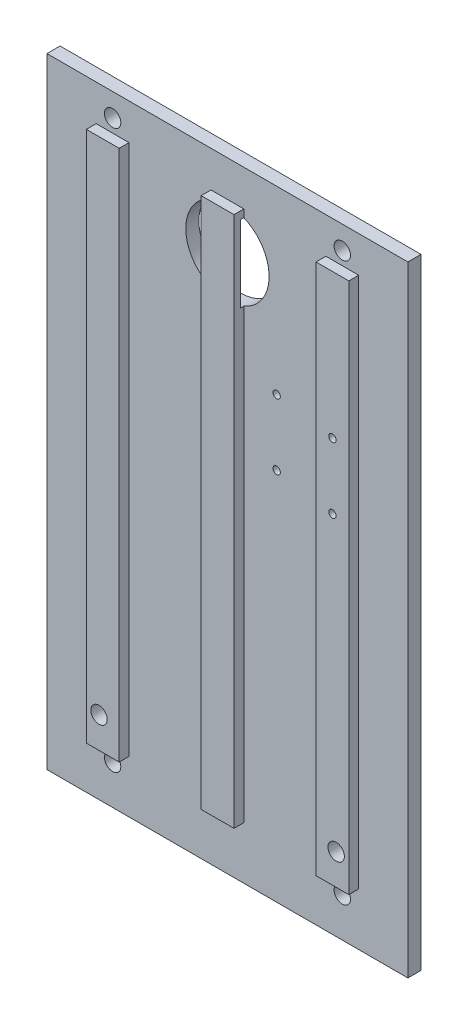
ISO-10303-21;
HEADER;
FILE_DESCRIPTION(('STEP AP214'),'2;1');
FILE_NAME('part.step','',(''),(''),'','','');
FILE_SCHEMA(('AUTOMOTIVE_DESIGN { 1 0 10303 214 1 1 1 1 }'));
ENDSEC;
DATA;
#1=APPLICATION_CONTEXT('core data for automotive mechanical design processes');
#2=APPLICATION_PROTOCOL_DEFINITION('international standard','automotive_design',2000,#1);
#3=PRODUCT_CONTEXT('',#1,'mechanical');
#4=PRODUCT('Part','Part','',(#3));
#5=PRODUCT_RELATED_PRODUCT_CATEGORY('part','',(#4));
#6=PRODUCT_DEFINITION_FORMATION('','',#4);
#7=PRODUCT_DEFINITION_CONTEXT('part definition',#1,'design');
#8=PRODUCT_DEFINITION('design','',#6,#7);
#9=PRODUCT_DEFINITION_SHAPE('','',#8);
#10=(LENGTH_UNIT() NAMED_UNIT(*) SI_UNIT(.MILLI.,.METRE.));
#11=(NAMED_UNIT(*) PLANE_ANGLE_UNIT() SI_UNIT($,.RADIAN.));
#12=(NAMED_UNIT(*) SI_UNIT($,.STERADIAN.) SOLID_ANGLE_UNIT());
#13=UNCERTAINTY_MEASURE_WITH_UNIT(LENGTH_MEASURE(1.E-05),#10,'distance_accuracy_value','');
#14=(GEOMETRIC_REPRESENTATION_CONTEXT(3) GLOBAL_UNCERTAINTY_ASSIGNED_CONTEXT((#13)) GLOBAL_UNIT_ASSIGNED_CONTEXT((#10,
#11,#12)) REPRESENTATION_CONTEXT('',''));
#15=CARTESIAN_POINT('',(0.,0.,0.));
#16=DIRECTION('',(0.,0.,1.));
#17=DIRECTION('',(1.,0.,0.));
#18=AXIS2_PLACEMENT_3D('',#15,#16,#17);
#19=CARTESIAN_POINT('',(0.,0.,4.));
#20=DIRECTION('',(0.,0.,-1.));
#21=DIRECTION('',(-1.,0.,0.));
#22=AXIS2_PLACEMENT_3D('',#19,#20,#21);
#23=PLANE('',#22);
#24=CARTESIAN_POINT('',(90.,182.,4.));
#25=DIRECTION('',(0.,0.,-1.));
#26=DIRECTION('',(-1.,0.,0.));
#27=AXIS2_PLACEMENT_3D('',#24,#25,#26);
#28=CIRCLE('',#27,2.5);
#29=CARTESIAN_POINT('',(87.5,182.,4.));
#30=VERTEX_POINT('',#29);
#31=EDGE_CURVE('E248',#30,#30,#28,.F.);
#32=ORIENTED_EDGE('',*,*,#31,.F.);
#33=EDGE_LOOP('',(#32));
#34=FACE_BOUND('',#33,.T.);
#35=CARTESIAN_POINT('',(70.,114.,4.));
#36=DIRECTION('',(0.,0.,-1.));
#37=DIRECTION('',(-1.,0.,0.));
#38=AXIS2_PLACEMENT_3D('',#35,#36,#37);
#39=CIRCLE('',#38,1.11999999999998);
#40=CARTESIAN_POINT('',(68.88,114.,4.));
#41=VERTEX_POINT('',#40);
#42=EDGE_CURVE('E228',#41,#41,#39,.T.);
#43=ORIENTED_EDGE('',*,*,#42,.T.);
#44=EDGE_LOOP('',(#43));
#45=FACE_BOUND('',#44,.T.);
#46=CARTESIAN_POINT('',(90.,12.,4.));
#47=DIRECTION('',(0.,0.,-1.));
#48=DIRECTION('',(-1.,0.,0.));
#49=AXIS2_PLACEMENT_3D('',#46,#47,#48);
#50=CIRCLE('',#49,2.5);
#51=CARTESIAN_POINT('',(87.5,12.,4.));
#52=VERTEX_POINT('',#51);
#53=EDGE_CURVE('E223',#52,#52,#50,.F.);
#54=ORIENTED_EDGE('',*,*,#53,.F.);
#55=EDGE_LOOP('',(#54));
#56=FACE_BOUND('',#55,.T.);
#57=DIRECTION('',(0.,-1.,0.));
#58=VECTOR('',#57,1.);
#59=CARTESIAN_POINT('',(15.,178.,4.));
#60=LINE('',#59,#58);
#61=CARTESIAN_POINT('',(15.,178.,4.));
#62=VERTEX_POINT('',#61);
#63=CARTESIAN_POINT('',(15.,16.,4.));
#64=VERTEX_POINT('',#63);
#65=EDGE_CURVE('E297',#62,#64,#60,.T.);
#66=ORIENTED_EDGE('',*,*,#65,.F.);
#67=DIRECTION('',(-1.,0.,0.));
#68=VECTOR('',#67,1.);
#69=CARTESIAN_POINT('',(15.,178.,4.));
#70=LINE('',#69,#68);
#71=CARTESIAN_POINT('',(25.,178.,4.));
#72=VERTEX_POINT('',#71);
#73=EDGE_CURVE('E303',#72,#62,#70,.T.);
#74=ORIENTED_EDGE('',*,*,#73,.F.);
#75=DIRECTION('',(0.,1.,0.));
#76=VECTOR('',#75,1.);
#77=CARTESIAN_POINT('',(25.,178.,4.));
#78=LINE('',#77,#76);
#79=CARTESIAN_POINT('',(25.,16.,4.));
#80=VERTEX_POINT('',#79);
#81=EDGE_CURVE('E320',#80,#72,#78,.T.);
#82=ORIENTED_EDGE('',*,*,#81,.F.);
#83=DIRECTION('',(1.,0.,0.));
#84=VECTOR('',#83,1.);
#85=CARTESIAN_POINT('',(15.,16.,4.));
#86=LINE('',#85,#84);
#87=EDGE_CURVE('E316',#64,#80,#86,.T.);
#88=ORIENTED_EDGE('',*,*,#87,.F.);
#89=EDGE_LOOP('',(#66,#74,#82,#88));
#90=FACE_BOUND('',#89,.T.);
#91=DIRECTION('',(0.,-1.,0.));
#92=VECTOR('',#91,1.);
#93=CARTESIAN_POINT('',(0.,0.,4.));
#94=LINE('',#93,#92);
#95=CARTESIAN_POINT('',(0.,189.,4.));
#96=VERTEX_POINT('',#95);
#97=CARTESIAN_POINT('',(0.,0.,4.));
#98=VERTEX_POINT('',#97);
#99=EDGE_CURVE('E387',#96,#98,#94,.T.);
#100=ORIENTED_EDGE('',*,*,#99,.T.);
#101=DIRECTION('',(1.,0.,0.));
#102=VECTOR('',#101,1.);
#103=CARTESIAN_POINT('',(0.,0.,4.));
#104=LINE('',#103,#102);
#105=CARTESIAN_POINT('',(110.,0.,4.));
#106=VERTEX_POINT('',#105);
#107=EDGE_CURVE('E391',#98,#106,#104,.T.);
#108=ORIENTED_EDGE('',*,*,#107,.T.);
#109=DIRECTION('',(0.,1.,0.));
#110=VECTOR('',#109,1.);
#111=CARTESIAN_POINT('',(110.,0.,4.));
#112=LINE('',#111,#110);
#113=CARTESIAN_POINT('',(110.,189.,4.));
#114=VERTEX_POINT('',#113);
#115=EDGE_CURVE('E395',#106,#114,#112,.T.);
#116=ORIENTED_EDGE('',*,*,#115,.T.);
#117=DIRECTION('',(-1.,0.,0.));
#118=VECTOR('',#117,1.);
#119=CARTESIAN_POINT('',(0.,189.,4.));
#120=LINE('',#119,#118);
#121=EDGE_CURVE('E398',#114,#96,#120,.T.);
#122=ORIENTED_EDGE('',*,*,#121,.T.);
#123=EDGE_LOOP('',(#100,#108,#116,#122));
#124=FACE_BOUND('',#123,.T.);
#125=DIRECTION('',(0.,1.,0.));
#126=VECTOR('',#125,1.);
#127=CARTESIAN_POINT('',(60.,178.,4.));
#128=LINE('',#127,#126);
#129=CARTESIAN_POINT('',(60.,175.67433081594,4.));
#130=VERTEX_POINT('',#129);
#131=CARTESIAN_POINT('',(60.,178.,4.));
#132=VERTEX_POINT('',#131);
#133=EDGE_CURVE('E364',#130,#132,#128,.T.);
#134=ORIENTED_EDGE('',*,*,#133,.F.);
#135=CARTESIAN_POINT('',(55.,164.,4.));
#136=DIRECTION('',(0.,0.,-1.));
#137=DIRECTION('',(-1.,0.,0.));
#138=AXIS2_PLACEMENT_3D('',#135,#136,#137);
#139=CIRCLE('',#138,12.7);
#140=CARTESIAN_POINT('',(60.,152.32566918406,4.));
#141=VERTEX_POINT('',#140);
#142=EDGE_CURVE('E177',#130,#141,#139,.T.);
#143=ORIENTED_EDGE('',*,*,#142,.T.);
#144=CARTESIAN_POINT('',(60.,16.,4.));
#145=VERTEX_POINT('',#144);
#146=EDGE_CURVE('E365',#145,#141,#128,.T.);
#147=ORIENTED_EDGE('',*,*,#146,.F.);
#148=DIRECTION('',(1.,0.,0.));
#149=VECTOR('',#148,1.);
#150=CARTESIAN_POINT('',(50.,16.,4.));
#151=LINE('',#150,#149);
#152=CARTESIAN_POINT('',(50.,16.,4.));
#153=VERTEX_POINT('',#152);
#154=EDGE_CURVE('E360',#153,#145,#151,.T.);
#155=ORIENTED_EDGE('',*,*,#154,.F.);
#156=DIRECTION('',(0.,-1.,0.));
#157=VECTOR('',#156,1.);
#158=CARTESIAN_POINT('',(50.,178.,4.));
#159=LINE('',#158,#157);
#160=CARTESIAN_POINT('',(50.,152.32566918406,4.));
#161=VERTEX_POINT('',#160);
#162=EDGE_CURVE('E342',#161,#153,#159,.T.);
#163=ORIENTED_EDGE('',*,*,#162,.F.);
#164=CARTESIAN_POINT('',(50.,175.67433081594,4.));
#165=VERTEX_POINT('',#164);
#166=EDGE_CURVE('E191',#161,#165,#139,.T.);
#167=ORIENTED_EDGE('',*,*,#166,.T.);
#168=CARTESIAN_POINT('',(50.,178.,4.));
#169=VERTEX_POINT('',#168);
#170=EDGE_CURVE('E189',#169,#165,#159,.T.);
#171=ORIENTED_EDGE('',*,*,#170,.F.);
#172=DIRECTION('',(-1.,0.,0.));
#173=VECTOR('',#172,1.);
#174=CARTESIAN_POINT('',(50.,178.,4.));
#175=LINE('',#174,#173);
#176=EDGE_CURVE('E348',#132,#169,#175,.T.);
#177=ORIENTED_EDGE('',*,*,#176,.F.);
#178=EDGE_LOOP('',(#134,#143,#147,#155,#163,#167,#171,#177));
#179=FACE_BOUND('',#178,.T.);
#180=DIRECTION('',(0.,-1.,0.));
#181=VECTOR('',#180,1.);
#182=CARTESIAN_POINT('',(85.,178.,4.));
#183=LINE('',#182,#181);
#184=CARTESIAN_POINT('',(85.,178.,4.));
#185=VERTEX_POINT('',#184);
#186=CARTESIAN_POINT('',(85.,16.,4.));
#187=VERTEX_POINT('',#186);
#188=EDGE_CURVE('E252',#185,#187,#183,.T.);
#189=ORIENTED_EDGE('',*,*,#188,.F.);
#190=DIRECTION('',(-1.,0.,0.));
#191=VECTOR('',#190,1.);
#192=CARTESIAN_POINT('',(85.,178.,4.));
#193=LINE('',#192,#191);
#194=CARTESIAN_POINT('',(95.,178.,4.));
#195=VERTEX_POINT('',#194);
#196=EDGE_CURVE('E258',#195,#185,#193,.T.);
#197=ORIENTED_EDGE('',*,*,#196,.F.);
#198=DIRECTION('',(0.,1.,0.));
#199=VECTOR('',#198,1.);
#200=CARTESIAN_POINT('',(95.,178.,4.));
#201=LINE('',#200,#199);
#202=CARTESIAN_POINT('',(95.,16.,4.));
#203=VERTEX_POINT('',#202);
#204=EDGE_CURVE('E275',#203,#195,#201,.T.);
#205=ORIENTED_EDGE('',*,*,#204,.F.);
#206=DIRECTION('',(1.,0.,0.));
#207=VECTOR('',#206,1.);
#208=CARTESIAN_POINT('',(85.,16.,4.));
#209=LINE('',#208,#207);
#210=EDGE_CURVE('E271',#187,#203,#209,.T.);
#211=ORIENTED_EDGE('',*,*,#210,.F.);
#212=EDGE_LOOP('',(#189,#197,#205,#211));
#213=FACE_BOUND('',#212,.T.);
#214=CARTESIAN_POINT('',(20.,182.,4.));
#215=DIRECTION('',(0.,0.,-1.));
#216=DIRECTION('',(-1.,0.,0.));
#217=AXIS2_PLACEMENT_3D('',#214,#215,#216);
#218=CIRCLE('',#217,2.5);
#219=CARTESIAN_POINT('',(17.5,182.,4.));
#220=VERTEX_POINT('',#219);
#221=EDGE_CURVE('E233',#220,#220,#218,.F.);
#222=ORIENTED_EDGE('',*,*,#221,.F.);
#223=EDGE_LOOP('',(#222));
#224=FACE_BOUND('',#223,.T.);
#225=CARTESIAN_POINT('',(20.,12.,4.));
#226=DIRECTION('',(0.,0.,-1.));
#227=DIRECTION('',(-1.,0.,0.));
#228=AXIS2_PLACEMENT_3D('',#225,#226,#227);
#229=CIRCLE('',#228,2.5);
#230=CARTESIAN_POINT('',(17.5,12.,4.));
#231=VERTEX_POINT('',#230);
#232=EDGE_CURVE('E238',#231,#231,#229,.F.);
#233=ORIENTED_EDGE('',*,*,#232,.F.);
#234=EDGE_LOOP('',(#233));
#235=FACE_BOUND('',#234,.T.);
#236=CARTESIAN_POINT('',(70.,134.,4.));
#237=DIRECTION('',(0.,0.,-1.));
#238=DIRECTION('',(-1.,0.,0.));
#239=AXIS2_PLACEMENT_3D('',#236,#237,#238);
#240=CIRCLE('',#239,1.12);
#241=CARTESIAN_POINT('',(68.88,134.,4.));
#242=VERTEX_POINT('',#241);
#243=EDGE_CURVE('E243',#242,#242,#240,.T.);
#244=ORIENTED_EDGE('',*,*,#243,.T.);
#245=EDGE_LOOP('',(#244));
#246=FACE_BOUND('',#245,.T.);
#247=ADVANCED_FACE('F36',(#34,#45,#56,#90,#124,#179,#213,#224,#235,#246),#23,.F.);
#248=CARTESIAN_POINT('',(0.,0.,0.));
#249=DIRECTION('',(0.,0.,-1.));
#250=DIRECTION('',(-1.,0.,0.));
#251=AXIS2_PLACEMENT_3D('',#248,#249,#250);
#252=PLANE('',#251);
#253=CARTESIAN_POINT('',(55.,164.,0.));
#254=DIRECTION('',(0.,0.,-1.));
#255=DIRECTION('',(-1.,0.,0.));
#256=AXIS2_PLACEMENT_3D('',#253,#254,#255);
#257=CIRCLE('',#256,12.7);
#258=CARTESIAN_POINT('',(42.3,164.,0.));
#259=VERTEX_POINT('',#258);
#260=EDGE_CURVE('E952',#259,#259,#257,.T.);
#261=ORIENTED_EDGE('',*,*,#260,.F.);
#262=EDGE_LOOP('',(#261));
#263=FACE_BOUND('',#262,.T.);
#264=CARTESIAN_POINT('',(90.,182.,0.));
#265=DIRECTION('',(0.,0.,-1.));
#266=DIRECTION('',(-1.,0.,0.));
#267=AXIS2_PLACEMENT_3D('',#264,#265,#266);
#268=CIRCLE('',#267,2.5);
#269=CARTESIAN_POINT('',(87.5,182.,0.));
#270=VERTEX_POINT('',#269);
#271=EDGE_CURVE('E247',#270,#270,#268,.F.);
#272=ORIENTED_EDGE('',*,*,#271,.T.);
#273=EDGE_LOOP('',(#272));
#274=FACE_BOUND('',#273,.T.);
#275=CARTESIAN_POINT('',(20.,12.,0.));
#276=DIRECTION('',(0.,0.,-1.));
#277=DIRECTION('',(-1.,0.,0.));
#278=AXIS2_PLACEMENT_3D('',#275,#276,#277);
#279=CIRCLE('',#278,2.5);
#280=CARTESIAN_POINT('',(17.5,12.,0.));
#281=VERTEX_POINT('',#280);
#282=EDGE_CURVE('E237',#281,#281,#279,.F.);
#283=ORIENTED_EDGE('',*,*,#282,.T.);
#284=EDGE_LOOP('',(#283));
#285=FACE_BOUND('',#284,.T.);
#286=CARTESIAN_POINT('',(18.86,25.4,0.));
#287=DIRECTION('',(0.,0.,-1.));
#288=DIRECTION('',(-1.,0.,0.));
#289=AXIS2_PLACEMENT_3D('',#286,#287,#288);
#290=CIRCLE('',#289,2.5);
#291=CARTESIAN_POINT('',(16.36,25.4,0.));
#292=VERTEX_POINT('',#291);
#293=EDGE_CURVE('E218',#292,#292,#290,.F.);
#294=ORIENTED_EDGE('',*,*,#293,.T.);
#295=EDGE_LOOP('',(#294));
#296=FACE_BOUND('',#295,.T.);
#297=CARTESIAN_POINT('',(91.14,25.4,0.));
#298=DIRECTION('',(0.,0.,-1.));
#299=DIRECTION('',(-1.,0.,0.));
#300=AXIS2_PLACEMENT_3D('',#297,#298,#299);
#301=CIRCLE('',#300,2.5);
#302=CARTESIAN_POINT('',(88.64,25.4,0.));
#303=VERTEX_POINT('',#302);
#304=EDGE_CURVE('E203',#303,#303,#301,.F.);
#305=ORIENTED_EDGE('',*,*,#304,.T.);
#306=EDGE_LOOP('',(#305));
#307=FACE_BOUND('',#306,.T.);
#308=CARTESIAN_POINT('',(20.,182.,0.));
#309=DIRECTION('',(0.,0.,-1.));
#310=DIRECTION('',(-1.,0.,0.));
#311=AXIS2_PLACEMENT_3D('',#308,#309,#310);
#312=CIRCLE('',#311,2.5);
#313=CARTESIAN_POINT('',(17.5,182.,0.));
#314=VERTEX_POINT('',#313);
#315=EDGE_CURVE('E232',#314,#314,#312,.F.);
#316=ORIENTED_EDGE('',*,*,#315,.T.);
#317=EDGE_LOOP('',(#316));
#318=FACE_BOUND('',#317,.T.);
#319=CARTESIAN_POINT('',(90.,12.,0.));
#320=DIRECTION('',(0.,0.,-1.));
#321=DIRECTION('',(-1.,0.,0.));
#322=AXIS2_PLACEMENT_3D('',#319,#320,#321);
#323=CIRCLE('',#322,2.5);
#324=CARTESIAN_POINT('',(87.5,12.,0.));
#325=VERTEX_POINT('',#324);
#326=EDGE_CURVE('E222',#325,#325,#323,.F.);
#327=ORIENTED_EDGE('',*,*,#326,.T.);
#328=EDGE_LOOP('',(#327));
#329=FACE_BOUND('',#328,.T.);
#330=DIRECTION('',(0.,-1.,0.));
#331=VECTOR('',#330,1.);
#332=CARTESIAN_POINT('',(0.,0.,0.));
#333=LINE('',#332,#331);
#334=CARTESIAN_POINT('',(0.,189.,0.));
#335=VERTEX_POINT('',#334);
#336=CARTESIAN_POINT('',(0.,0.,0.));
#337=VERTEX_POINT('',#336);
#338=EDGE_CURVE('E386',#335,#337,#333,.T.);
#339=ORIENTED_EDGE('',*,*,#338,.F.);
#340=DIRECTION('',(-1.,0.,0.));
#341=VECTOR('',#340,1.);
#342=CARTESIAN_POINT('',(0.,189.,0.));
#343=LINE('',#342,#341);
#344=CARTESIAN_POINT('',(110.,189.,0.));
#345=VERTEX_POINT('',#344);
#346=EDGE_CURVE('E392',#345,#335,#343,.T.);
#347=ORIENTED_EDGE('',*,*,#346,.F.);
#348=DIRECTION('',(0.,1.,0.));
#349=VECTOR('',#348,1.);
#350=CARTESIAN_POINT('',(110.,0.,0.));
#351=LINE('',#350,#349);
#352=CARTESIAN_POINT('',(110.,0.,0.));
#353=VERTEX_POINT('',#352);
#354=EDGE_CURVE('E408',#353,#345,#351,.T.);
#355=ORIENTED_EDGE('',*,*,#354,.F.);
#356=DIRECTION('',(1.,0.,0.));
#357=VECTOR('',#356,1.);
#358=CARTESIAN_POINT('',(0.,0.,0.));
#359=LINE('',#358,#357);
#360=EDGE_CURVE('E405',#337,#353,#359,.T.);
#361=ORIENTED_EDGE('',*,*,#360,.F.);
#362=EDGE_LOOP('',(#339,#347,#355,#361));
#363=FACE_BOUND('',#362,.T.);
#364=CARTESIAN_POINT('',(70.,114.,0.));
#365=DIRECTION('',(0.,0.,-1.));
#366=DIRECTION('',(-1.,0.,0.));
#367=AXIS2_PLACEMENT_3D('',#364,#365,#366);
#368=CIRCLE('',#367,1.11999999999998);
#369=CARTESIAN_POINT('',(68.88,114.,0.));
#370=VERTEX_POINT('',#369);
#371=EDGE_CURVE('E227',#370,#370,#368,.T.);
#372=ORIENTED_EDGE('',*,*,#371,.F.);
#373=EDGE_LOOP('',(#372));
#374=FACE_BOUND('',#373,.T.);
#375=CARTESIAN_POINT('',(90.,114.,0.));
#376=DIRECTION('',(0.,0.,-1.));
#377=DIRECTION('',(-1.,0.,0.));
#378=AXIS2_PLACEMENT_3D('',#375,#376,#377);
#379=CIRCLE('',#378,1.12000000000001);
#380=CARTESIAN_POINT('',(88.88,114.,0.));
#381=VERTEX_POINT('',#380);
#382=EDGE_CURVE('E208',#381,#381,#379,.T.);
#383=ORIENTED_EDGE('',*,*,#382,.F.);
#384=EDGE_LOOP('',(#383));
#385=FACE_BOUND('',#384,.T.);
#386=CARTESIAN_POINT('',(90.,134.,0.));
#387=DIRECTION('',(0.,0.,-1.));
#388=DIRECTION('',(-1.,0.,0.));
#389=AXIS2_PLACEMENT_3D('',#386,#387,#388);
#390=CIRCLE('',#389,1.12);
#391=CARTESIAN_POINT('',(88.88,134.,0.));
#392=VERTEX_POINT('',#391);
#393=EDGE_CURVE('E213',#392,#392,#390,.T.);
#394=ORIENTED_EDGE('',*,*,#393,.F.);
#395=EDGE_LOOP('',(#394));
#396=FACE_BOUND('',#395,.T.);
#397=CARTESIAN_POINT('',(70.,134.,0.));
#398=DIRECTION('',(0.,0.,-1.));
#399=DIRECTION('',(-1.,0.,0.));
#400=AXIS2_PLACEMENT_3D('',#397,#398,#399);
#401=CIRCLE('',#400,1.12);
#402=CARTESIAN_POINT('',(68.88,134.,0.));
#403=VERTEX_POINT('',#402);
#404=EDGE_CURVE('E242',#403,#403,#401,.T.);
#405=ORIENTED_EDGE('',*,*,#404,.F.);
#406=EDGE_LOOP('',(#405));
#407=FACE_BOUND('',#406,.T.);
#408=ADVANCED_FACE('F547',(#263,#274,#285,#296,#307,#318,#329,#363,#374,#385,#396,#407),#252,.T.);
#409=CARTESIAN_POINT('',(0.,0.,7.));
#410=DIRECTION('',(0.,0.,1.));
#411=DIRECTION('',(1.,0.,0.));
#412=AXIS2_PLACEMENT_3D('',#409,#410,#411);
#413=PLANE('',#412);
#414=CARTESIAN_POINT('',(91.14,25.4,7.));
#415=DIRECTION('',(0.,0.,1.));
#416=DIRECTION('',(1.,0.,0.));
#417=AXIS2_PLACEMENT_3D('',#414,#415,#416);
#418=CIRCLE('',#417,2.5);
#419=CARTESIAN_POINT('',(93.64,25.4,7.));
#420=VERTEX_POINT('',#419);
#421=EDGE_CURVE('E202',#420,#420,#418,.F.);
#422=ORIENTED_EDGE('',*,*,#421,.T.);
#423=EDGE_LOOP('',(#422));
#424=FACE_BOUND('',#423,.T.);
#425=DIRECTION('',(0.,-1.,0.));
#426=VECTOR('',#425,1.);
#427=CARTESIAN_POINT('',(85.,178.,7.));
#428=LINE('',#427,#426);
#429=CARTESIAN_POINT('',(85.,178.,7.));
#430=VERTEX_POINT('',#429);
#431=CARTESIAN_POINT('',(85.,16.,7.));
#432=VERTEX_POINT('',#431);
#433=EDGE_CURVE('E253',#430,#432,#428,.T.);
#434=ORIENTED_EDGE('',*,*,#433,.T.);
#435=DIRECTION('',(1.,0.,0.));
#436=VECTOR('',#435,1.);
#437=CARTESIAN_POINT('',(85.,16.,7.));
#438=LINE('',#437,#436);
#439=CARTESIAN_POINT('',(95.,16.,7.));
#440=VERTEX_POINT('',#439);
#441=EDGE_CURVE('E257',#432,#440,#438,.T.);
#442=ORIENTED_EDGE('',*,*,#441,.T.);
#443=DIRECTION('',(0.,1.,0.));
#444=VECTOR('',#443,1.);
#445=CARTESIAN_POINT('',(95.,178.,7.));
#446=LINE('',#445,#444);
#447=CARTESIAN_POINT('',(95.,178.,7.));
#448=VERTEX_POINT('',#447);
#449=EDGE_CURVE('E261',#440,#448,#446,.T.);
#450=ORIENTED_EDGE('',*,*,#449,.T.);
#451=DIRECTION('',(-1.,0.,0.));
#452=VECTOR('',#451,1.);
#453=CARTESIAN_POINT('',(85.,178.,7.));
#454=LINE('',#453,#452);
#455=EDGE_CURVE('E264',#448,#430,#454,.T.);
#456=ORIENTED_EDGE('',*,*,#455,.T.);
#457=EDGE_LOOP('',(#434,#442,#450,#456));
#458=FACE_BOUND('',#457,.T.);
#459=CARTESIAN_POINT('',(90.,114.,7.));
#460=DIRECTION('',(0.,0.,1.));
#461=DIRECTION('',(1.,0.,0.));
#462=AXIS2_PLACEMENT_3D('',#459,#460,#461);
#463=CIRCLE('',#462,1.12000000000001);
#464=CARTESIAN_POINT('',(91.12,114.,7.));
#465=VERTEX_POINT('',#464);
#466=EDGE_CURVE('E207',#465,#465,#463,.T.);
#467=ORIENTED_EDGE('',*,*,#466,.F.);
#468=EDGE_LOOP('',(#467));
#469=FACE_BOUND('',#468,.T.);
#470=CARTESIAN_POINT('',(90.,134.,7.));
#471=DIRECTION('',(0.,0.,1.));
#472=DIRECTION('',(1.,0.,0.));
#473=AXIS2_PLACEMENT_3D('',#470,#471,#472);
#474=CIRCLE('',#473,1.12);
#475=CARTESIAN_POINT('',(91.12,134.,7.));
#476=VERTEX_POINT('',#475);
#477=EDGE_CURVE('E212',#476,#476,#474,.T.);
#478=ORIENTED_EDGE('',*,*,#477,.F.);
#479=EDGE_LOOP('',(#478));
#480=FACE_BOUND('',#479,.T.);
#481=ADVANCED_FACE('F553',(#424,#458,#469,#480),#413,.T.);
#482=CARTESIAN_POINT('',(0.,0.,4.));
#483=DIRECTION('',(1.,0.,0.));
#484=DIRECTION('',(0.,0.,-1.));
#485=AXIS2_PLACEMENT_3D('',#482,#483,#484);
#486=PLANE('',#485);
#487=ORIENTED_EDGE('',*,*,#338,.T.);
#488=DIRECTION('',(0.,0.,-1.));
#489=VECTOR('',#488,1.);
#490=CARTESIAN_POINT('',(0.,0.,4.));
#491=LINE('',#490,#489);
#492=EDGE_CURVE('E424',#98,#337,#491,.T.);
#493=ORIENTED_EDGE('',*,*,#492,.F.);
#494=ORIENTED_EDGE('',*,*,#99,.F.);
#495=DIRECTION('',(0.,0.,-1.));
#496=VECTOR('',#495,1.);
#497=CARTESIAN_POINT('',(0.,189.,4.));
#498=LINE('',#497,#496);
#499=EDGE_CURVE('E401',#96,#335,#498,.T.);
#500=ORIENTED_EDGE('',*,*,#499,.T.);
#501=EDGE_LOOP('',(#487,#493,#494,#500));
#502=FACE_BOUND('',#501,.T.);
#503=ADVANCED_FACE('F38',(#502),#486,.F.);
#504=CARTESIAN_POINT('',(0.,0.,4.));
#505=DIRECTION('',(0.,1.,0.));
#506=DIRECTION('',(0.,0.,1.));
#507=AXIS2_PLACEMENT_3D('',#504,#505,#506);
#508=PLANE('',#507);
#509=ORIENTED_EDGE('',*,*,#360,.T.);
#510=DIRECTION('',(0.,0.,-1.));
#511=VECTOR('',#510,1.);
#512=CARTESIAN_POINT('',(110.,0.,4.));
#513=LINE('',#512,#511);
#514=EDGE_CURVE('E420',#106,#353,#513,.T.);
#515=ORIENTED_EDGE('',*,*,#514,.F.);
#516=ORIENTED_EDGE('',*,*,#107,.F.);
#517=ORIENTED_EDGE('',*,*,#492,.T.);
#518=EDGE_LOOP('',(#509,#515,#516,#517));
#519=FACE_BOUND('',#518,.T.);
#520=ADVANCED_FACE('F567',(#519),#508,.F.);
#521=CARTESIAN_POINT('',(110.,0.,4.));
#522=DIRECTION('',(-1.,0.,0.));
#523=DIRECTION('',(0.,0.,1.));
#524=AXIS2_PLACEMENT_3D('',#521,#522,#523);
#525=PLANE('',#524);
#526=ORIENTED_EDGE('',*,*,#354,.T.);
#527=DIRECTION('',(0.,0.,-1.));
#528=VECTOR('',#527,1.);
#529=CARTESIAN_POINT('',(110.,189.,4.));
#530=LINE('',#529,#528);
#531=EDGE_CURVE('E416',#114,#345,#530,.T.);
#532=ORIENTED_EDGE('',*,*,#531,.F.);
#533=ORIENTED_EDGE('',*,*,#115,.F.);
#534=ORIENTED_EDGE('',*,*,#514,.T.);
#535=EDGE_LOOP('',(#526,#532,#533,#534));
#536=FACE_BOUND('',#535,.T.);
#537=ADVANCED_FACE('F564',(#536),#525,.F.);
#538=CARTESIAN_POINT('',(0.,189.,4.));
#539=DIRECTION('',(0.,-1.,0.));
#540=DIRECTION('',(0.,0.,-1.));
#541=AXIS2_PLACEMENT_3D('',#538,#539,#540);
#542=PLANE('',#541);
#543=ORIENTED_EDGE('',*,*,#346,.T.);
#544=ORIENTED_EDGE('',*,*,#499,.F.);
#545=ORIENTED_EDGE('',*,*,#121,.F.);
#546=ORIENTED_EDGE('',*,*,#531,.T.);
#547=EDGE_LOOP('',(#543,#544,#545,#546));
#548=FACE_BOUND('',#547,.T.);
#549=ADVANCED_FACE('F561',(#548),#542,.F.);
#550=CARTESIAN_POINT('',(50.,178.,7.));
#551=DIRECTION('',(1.,0.,0.));
#552=DIRECTION('',(0.,1.,0.));
#553=AXIS2_PLACEMENT_3D('',#550,#551,#552);
#554=PLANE('',#553);
#555=DIRECTION('',(0.,1.,0.));
#556=VECTOR('',#555,1.);
#557=CARTESIAN_POINT('',(50.,178.,5.));
#558=LINE('',#557,#556);
#559=CARTESIAN_POINT('',(50.,152.32566918406,5.));
#560=VERTEX_POINT('',#559);
#561=CARTESIAN_POINT('',(50.,175.67433081594,5.));
#562=VERTEX_POINT('',#561);
#563=EDGE_CURVE('E171',#560,#562,#558,.T.);
#564=ORIENTED_EDGE('',*,*,#563,.F.);
#565=DIRECTION('',(0.,0.,-1.));
#566=VECTOR('',#565,1.);
#567=CARTESIAN_POINT('',(50.,152.32566918406,5.));
#568=LINE('',#567,#566);
#569=EDGE_CURVE('E196',#560,#161,#568,.T.);
#570=ORIENTED_EDGE('',*,*,#569,.T.);
#571=ORIENTED_EDGE('',*,*,#162,.T.);
#572=DIRECTION('',(0.,0.,-1.));
#573=VECTOR('',#572,1.);
#574=CARTESIAN_POINT('',(50.,16.,7.));
#575=LINE('',#574,#573);
#576=CARTESIAN_POINT('',(50.,16.,7.));
#577=VERTEX_POINT('',#576);
#578=EDGE_CURVE('E382',#577,#153,#575,.T.);
#579=ORIENTED_EDGE('',*,*,#578,.F.);
#580=DIRECTION('',(0.,-1.,0.));
#581=VECTOR('',#580,1.);
#582=CARTESIAN_POINT('',(50.,178.,7.));
#583=LINE('',#582,#581);
#584=CARTESIAN_POINT('',(50.,178.,7.));
#585=VERTEX_POINT('',#584);
#586=EDGE_CURVE('E343',#585,#577,#583,.T.);
#587=ORIENTED_EDGE('',*,*,#586,.F.);
#588=DIRECTION('',(0.,0.,-1.));
#589=VECTOR('',#588,1.);
#590=CARTESIAN_POINT('',(50.,178.,7.));
#591=LINE('',#590,#589);
#592=EDGE_CURVE('E357',#585,#169,#591,.T.);
#593=ORIENTED_EDGE('',*,*,#592,.T.);
#594=ORIENTED_EDGE('',*,*,#170,.T.);
#595=DIRECTION('',(0.,0.,-1.));
#596=VECTOR('',#595,1.);
#597=CARTESIAN_POINT('',(50.,175.67433081594,5.));
#598=LINE('',#597,#596);
#599=EDGE_CURVE('E181',#165,#562,#598,.F.);
#600=ORIENTED_EDGE('',*,*,#599,.T.);
#601=EDGE_LOOP('',(#564,#570,#571,#579,#587,#593,#594,#600));
#602=FACE_BOUND('',#601,.T.);
#603=ADVANCED_FACE('F187',(#602),#554,.F.);
#604=CARTESIAN_POINT('',(50.,16.,7.));
#605=DIRECTION('',(0.,1.,0.));
#606=DIRECTION('',(0.,0.,1.));
#607=AXIS2_PLACEMENT_3D('',#604,#605,#606);
#608=PLANE('',#607);
#609=ORIENTED_EDGE('',*,*,#154,.T.);
#610=DIRECTION('',(0.,0.,-1.));
#611=VECTOR('',#610,1.);
#612=CARTESIAN_POINT('',(60.,16.,7.));
#613=LINE('',#612,#611);
#614=CARTESIAN_POINT('',(60.,16.,7.));
#615=VERTEX_POINT('',#614);
#616=EDGE_CURVE('E378',#615,#145,#613,.T.);
#617=ORIENTED_EDGE('',*,*,#616,.F.);
#618=DIRECTION('',(1.,0.,0.));
#619=VECTOR('',#618,1.);
#620=CARTESIAN_POINT('',(50.,16.,7.));
#621=LINE('',#620,#619);
#622=EDGE_CURVE('E347',#577,#615,#621,.T.);
#623=ORIENTED_EDGE('',*,*,#622,.F.);
#624=ORIENTED_EDGE('',*,*,#578,.T.);
#625=EDGE_LOOP('',(#609,#617,#623,#624));
#626=FACE_BOUND('',#625,.T.);
#627=ADVANCED_FACE('F529',(#626),#608,.F.);
#628=CARTESIAN_POINT('',(60.,178.,7.));
#629=DIRECTION('',(-1.,0.,0.));
#630=DIRECTION('',(0.,-1.,0.));
#631=AXIS2_PLACEMENT_3D('',#628,#629,#630);
#632=PLANE('',#631);
#633=DIRECTION('',(0.,-1.,0.));
#634=VECTOR('',#633,1.);
#635=CARTESIAN_POINT('',(60.,178.,5.));
#636=LINE('',#635,#634);
#637=CARTESIAN_POINT('',(60.,175.67433081594,5.));
#638=VERTEX_POINT('',#637);
#639=CARTESIAN_POINT('',(60.,152.32566918406,5.));
#640=VERTEX_POINT('',#639);
#641=EDGE_CURVE('E428',#638,#640,#636,.T.);
#642=ORIENTED_EDGE('',*,*,#641,.F.);
#643=DIRECTION('',(0.,0.,-1.));
#644=VECTOR('',#643,1.);
#645=CARTESIAN_POINT('',(60.,175.67433081594,5.));
#646=LINE('',#645,#644);
#647=EDGE_CURVE('E11',#638,#130,#646,.T.);
#648=ORIENTED_EDGE('',*,*,#647,.T.);
#649=ORIENTED_EDGE('',*,*,#133,.T.);
#650=DIRECTION('',(0.,0.,-1.));
#651=VECTOR('',#650,1.);
#652=CARTESIAN_POINT('',(60.,178.,7.));
#653=LINE('',#652,#651);
#654=CARTESIAN_POINT('',(60.,178.,7.));
#655=VERTEX_POINT('',#654);
#656=EDGE_CURVE('E374',#655,#132,#653,.T.);
#657=ORIENTED_EDGE('',*,*,#656,.F.);
#658=DIRECTION('',(0.,1.,0.));
#659=VECTOR('',#658,1.);
#660=CARTESIAN_POINT('',(60.,178.,7.));
#661=LINE('',#660,#659);
#662=EDGE_CURVE('E351',#615,#655,#661,.T.);
#663=ORIENTED_EDGE('',*,*,#662,.F.);
#664=ORIENTED_EDGE('',*,*,#616,.T.);
#665=ORIENTED_EDGE('',*,*,#146,.T.);
#666=DIRECTION('',(0.,0.,-1.));
#667=VECTOR('',#666,1.);
#668=CARTESIAN_POINT('',(60.,152.32566918406,5.));
#669=LINE('',#668,#667);
#670=EDGE_CURVE('E45',#141,#640,#669,.F.);
#671=ORIENTED_EDGE('',*,*,#670,.T.);
#672=EDGE_LOOP('',(#642,#648,#649,#657,#663,#664,#665,#671));
#673=FACE_BOUND('',#672,.T.);
#674=ADVANCED_FACE('F464',(#673),#632,.F.);
#675=CARTESIAN_POINT('',(50.,178.,7.));
#676=DIRECTION('',(0.,-1.,0.));
#677=DIRECTION('',(0.,0.,-1.));
#678=AXIS2_PLACEMENT_3D('',#675,#676,#677);
#679=PLANE('',#678);
#680=ORIENTED_EDGE('',*,*,#176,.T.);
#681=ORIENTED_EDGE('',*,*,#592,.F.);
#682=DIRECTION('',(-1.,0.,0.));
#683=VECTOR('',#682,1.);
#684=CARTESIAN_POINT('',(50.,178.,7.));
#685=LINE('',#684,#683);
#686=EDGE_CURVE('E354',#655,#585,#685,.T.);
#687=ORIENTED_EDGE('',*,*,#686,.F.);
#688=ORIENTED_EDGE('',*,*,#656,.T.);
#689=EDGE_LOOP('',(#680,#681,#687,#688));
#690=FACE_BOUND('',#689,.T.);
#691=ADVANCED_FACE('F536',(#690),#679,.F.);
#692=CARTESIAN_POINT('',(0.,0.,7.));
#693=DIRECTION('',(0.,0.,1.));
#694=DIRECTION('',(1.,0.,0.));
#695=AXIS2_PLACEMENT_3D('',#692,#693,#694);
#696=PLANE('',#695);
#697=ORIENTED_EDGE('',*,*,#586,.T.);
#698=ORIENTED_EDGE('',*,*,#622,.T.);
#699=ORIENTED_EDGE('',*,*,#662,.T.);
#700=ORIENTED_EDGE('',*,*,#686,.T.);
#701=EDGE_LOOP('',(#697,#698,#699,#700));
#702=FACE_BOUND('',#701,.T.);
#703=ADVANCED_FACE('F532',(#702),#696,.T.);
#704=CARTESIAN_POINT('',(15.,178.,7.));
#705=DIRECTION('',(1.,0.,0.));
#706=DIRECTION('',(0.,1.,0.));
#707=AXIS2_PLACEMENT_3D('',#704,#705,#706);
#708=PLANE('',#707);
#709=ORIENTED_EDGE('',*,*,#65,.T.);
#710=DIRECTION('',(0.,0.,-1.));
#711=VECTOR('',#710,1.);
#712=CARTESIAN_POINT('',(15.,16.,7.));
#713=LINE('',#712,#711);
#714=CARTESIAN_POINT('',(15.,16.,7.));
#715=VERTEX_POINT('',#714);
#716=EDGE_CURVE('E338',#715,#64,#713,.T.);
#717=ORIENTED_EDGE('',*,*,#716,.F.);
#718=DIRECTION('',(0.,-1.,0.));
#719=VECTOR('',#718,1.);
#720=CARTESIAN_POINT('',(15.,178.,7.));
#721=LINE('',#720,#719);
#722=CARTESIAN_POINT('',(15.,178.,7.));
#723=VERTEX_POINT('',#722);
#724=EDGE_CURVE('E298',#723,#715,#721,.T.);
#725=ORIENTED_EDGE('',*,*,#724,.F.);
#726=DIRECTION('',(0.,0.,-1.));
#727=VECTOR('',#726,1.);
#728=CARTESIAN_POINT('',(15.,178.,7.));
#729=LINE('',#728,#727);
#730=EDGE_CURVE('E312',#723,#62,#729,.T.);
#731=ORIENTED_EDGE('',*,*,#730,.T.);
#732=EDGE_LOOP('',(#709,#717,#725,#731));
#733=FACE_BOUND('',#732,.T.);
#734=ADVANCED_FACE('F543',(#733),#708,.F.);
#735=CARTESIAN_POINT('',(15.,16.,7.));
#736=DIRECTION('',(0.,1.,0.));
#737=DIRECTION('',(0.,0.,1.));
#738=AXIS2_PLACEMENT_3D('',#735,#736,#737);
#739=PLANE('',#738);
#740=ORIENTED_EDGE('',*,*,#87,.T.);
#741=DIRECTION('',(0.,0.,-1.));
#742=VECTOR('',#741,1.);
#743=CARTESIAN_POINT('',(25.,16.,7.));
#744=LINE('',#743,#742);
#745=CARTESIAN_POINT('',(25.,16.,7.));
#746=VERTEX_POINT('',#745);
#747=EDGE_CURVE('E334',#746,#80,#744,.T.);
#748=ORIENTED_EDGE('',*,*,#747,.F.);
#749=DIRECTION('',(1.,0.,0.));
#750=VECTOR('',#749,1.);
#751=CARTESIAN_POINT('',(15.,16.,7.));
#752=LINE('',#751,#750);
#753=EDGE_CURVE('E302',#715,#746,#752,.T.);
#754=ORIENTED_EDGE('',*,*,#753,.F.);
#755=ORIENTED_EDGE('',*,*,#716,.T.);
#756=EDGE_LOOP('',(#740,#748,#754,#755));
#757=FACE_BOUND('',#756,.T.);
#758=ADVANCED_FACE('F663',(#757),#739,.F.);
#759=CARTESIAN_POINT('',(25.,178.,7.));
#760=DIRECTION('',(-1.,0.,0.));
#761=DIRECTION('',(0.,-1.,0.));
#762=AXIS2_PLACEMENT_3D('',#759,#760,#761);
#763=PLANE('',#762);
#764=ORIENTED_EDGE('',*,*,#81,.T.);
#765=DIRECTION('',(0.,0.,-1.));
#766=VECTOR('',#765,1.);
#767=CARTESIAN_POINT('',(25.,178.,7.));
#768=LINE('',#767,#766);
#769=CARTESIAN_POINT('',(25.,178.,7.));
#770=VERTEX_POINT('',#769);
#771=EDGE_CURVE('E330',#770,#72,#768,.T.);
#772=ORIENTED_EDGE('',*,*,#771,.F.);
#773=DIRECTION('',(0.,1.,0.));
#774=VECTOR('',#773,1.);
#775=CARTESIAN_POINT('',(25.,178.,7.));
#776=LINE('',#775,#774);
#777=EDGE_CURVE('E306',#746,#770,#776,.T.);
#778=ORIENTED_EDGE('',*,*,#777,.F.);
#779=ORIENTED_EDGE('',*,*,#747,.T.);
#780=EDGE_LOOP('',(#764,#772,#778,#779));
#781=FACE_BOUND('',#780,.T.);
#782=ADVANCED_FACE('F659',(#781),#763,.F.);
#783=CARTESIAN_POINT('',(15.,178.,7.));
#784=DIRECTION('',(0.,-1.,0.));
#785=DIRECTION('',(0.,0.,-1.));
#786=AXIS2_PLACEMENT_3D('',#783,#784,#785);
#787=PLANE('',#786);
#788=ORIENTED_EDGE('',*,*,#73,.T.);
#789=ORIENTED_EDGE('',*,*,#730,.F.);
#790=DIRECTION('',(-1.,0.,0.));
#791=VECTOR('',#790,1.);
#792=CARTESIAN_POINT('',(15.,178.,7.));
#793=LINE('',#792,#791);
#794=EDGE_CURVE('E309',#770,#723,#793,.T.);
#795=ORIENTED_EDGE('',*,*,#794,.F.);
#796=ORIENTED_EDGE('',*,*,#771,.T.);
#797=EDGE_LOOP('',(#788,#789,#795,#796));
#798=FACE_BOUND('',#797,.T.);
#799=ADVANCED_FACE('F655',(#798),#787,.F.);
#800=CARTESIAN_POINT('',(0.,0.,7.));
#801=DIRECTION('',(0.,0.,1.));
#802=DIRECTION('',(1.,0.,0.));
#803=AXIS2_PLACEMENT_3D('',#800,#801,#802);
#804=PLANE('',#803);
#805=CARTESIAN_POINT('',(18.86,25.4,7.));
#806=DIRECTION('',(0.,0.,1.));
#807=DIRECTION('',(1.,0.,0.));
#808=AXIS2_PLACEMENT_3D('',#805,#806,#807);
#809=CIRCLE('',#808,2.5);
#810=CARTESIAN_POINT('',(21.36,25.4,7.));
#811=VERTEX_POINT('',#810);
#812=EDGE_CURVE('E217',#811,#811,#809,.F.);
#813=ORIENTED_EDGE('',*,*,#812,.T.);
#814=EDGE_LOOP('',(#813));
#815=FACE_BOUND('',#814,.T.);
#816=ORIENTED_EDGE('',*,*,#724,.T.);
#817=ORIENTED_EDGE('',*,*,#753,.T.);
#818=ORIENTED_EDGE('',*,*,#777,.T.);
#819=ORIENTED_EDGE('',*,*,#794,.T.);
#820=EDGE_LOOP('',(#816,#817,#818,#819));
#821=FACE_BOUND('',#820,.T.);
#822=ADVANCED_FACE('F651',(#815,#821),#804,.T.);
#823=CARTESIAN_POINT('',(85.,178.,7.));
#824=DIRECTION('',(1.,0.,0.));
#825=DIRECTION('',(0.,1.,0.));
#826=AXIS2_PLACEMENT_3D('',#823,#824,#825);
#827=PLANE('',#826);
#828=ORIENTED_EDGE('',*,*,#188,.T.);
#829=DIRECTION('',(0.,0.,-1.));
#830=VECTOR('',#829,1.);
#831=CARTESIAN_POINT('',(85.,16.,7.));
#832=LINE('',#831,#830);
#833=EDGE_CURVE('E293',#432,#187,#832,.T.);
#834=ORIENTED_EDGE('',*,*,#833,.F.);
#835=ORIENTED_EDGE('',*,*,#433,.F.);
#836=DIRECTION('',(0.,0.,-1.));
#837=VECTOR('',#836,1.);
#838=CARTESIAN_POINT('',(85.,178.,7.));
#839=LINE('',#838,#837);
#840=EDGE_CURVE('E267',#430,#185,#839,.T.);
#841=ORIENTED_EDGE('',*,*,#840,.T.);
#842=EDGE_LOOP('',(#828,#834,#835,#841));
#843=FACE_BOUND('',#842,.T.);
#844=ADVANCED_FACE('F647',(#843),#827,.F.);
#845=CARTESIAN_POINT('',(85.,16.,7.));
#846=DIRECTION('',(0.,1.,0.));
#847=DIRECTION('',(0.,0.,1.));
#848=AXIS2_PLACEMENT_3D('',#845,#846,#847);
#849=PLANE('',#848);
#850=ORIENTED_EDGE('',*,*,#210,.T.);
#851=DIRECTION('',(0.,0.,-1.));
#852=VECTOR('',#851,1.);
#853=CARTESIAN_POINT('',(95.,16.,7.));
#854=LINE('',#853,#852);
#855=EDGE_CURVE('E289',#440,#203,#854,.T.);
#856=ORIENTED_EDGE('',*,*,#855,.F.);
#857=ORIENTED_EDGE('',*,*,#441,.F.);
#858=ORIENTED_EDGE('',*,*,#833,.T.);
#859=EDGE_LOOP('',(#850,#856,#857,#858));
#860=FACE_BOUND('',#859,.T.);
#861=ADVANCED_FACE('F643',(#860),#849,.F.);
#862=CARTESIAN_POINT('',(95.,178.,7.));
#863=DIRECTION('',(-1.,0.,0.));
#864=DIRECTION('',(0.,-1.,0.));
#865=AXIS2_PLACEMENT_3D('',#862,#863,#864);
#866=PLANE('',#865);
#867=ORIENTED_EDGE('',*,*,#204,.T.);
#868=DIRECTION('',(0.,0.,-1.));
#869=VECTOR('',#868,1.);
#870=CARTESIAN_POINT('',(95.,178.,7.));
#871=LINE('',#870,#869);
#872=EDGE_CURVE('E285',#448,#195,#871,.T.);
#873=ORIENTED_EDGE('',*,*,#872,.F.);
#874=ORIENTED_EDGE('',*,*,#449,.F.);
#875=ORIENTED_EDGE('',*,*,#855,.T.);
#876=EDGE_LOOP('',(#867,#873,#874,#875));
#877=FACE_BOUND('',#876,.T.);
#878=ADVANCED_FACE('F639',(#877),#866,.F.);
#879=CARTESIAN_POINT('',(85.,178.,7.));
#880=DIRECTION('',(0.,-1.,0.));
#881=DIRECTION('',(0.,0.,-1.));
#882=AXIS2_PLACEMENT_3D('',#879,#880,#881);
#883=PLANE('',#882);
#884=ORIENTED_EDGE('',*,*,#196,.T.);
#885=ORIENTED_EDGE('',*,*,#840,.F.);
#886=ORIENTED_EDGE('',*,*,#455,.F.);
#887=ORIENTED_EDGE('',*,*,#872,.T.);
#888=EDGE_LOOP('',(#884,#885,#886,#887));
#889=FACE_BOUND('',#888,.T.);
#890=ADVANCED_FACE('F619',(#889),#883,.F.);
#891=CARTESIAN_POINT('',(91.14,25.4,9.));
#892=DIRECTION('',(0.,0.,-1.));
#893=DIRECTION('',(-1.,0.,0.));
#894=AXIS2_PLACEMENT_3D('',#891,#892,#893);
#895=CYLINDRICAL_SURFACE('',#894,2.5);
#896=ORIENTED_EDGE('',*,*,#304,.F.);
#897=EDGE_LOOP('',(#896));
#898=FACE_BOUND('',#897,.T.);
#899=ORIENTED_EDGE('',*,*,#421,.F.);
#900=EDGE_LOOP('',(#899));
#901=FACE_BOUND('',#900,.T.);
#902=ADVANCED_FACE('F615',(#898,#901),#895,.F.);
#903=CARTESIAN_POINT('',(90.,114.,9.));
#904=DIRECTION('',(0.,0.,-1.));
#905=DIRECTION('',(-1.,0.,0.));
#906=AXIS2_PLACEMENT_3D('',#903,#904,#905);
#907=CYLINDRICAL_SURFACE('',#906,1.12000000000001);
#908=ORIENTED_EDGE('',*,*,#382,.T.);
#909=EDGE_LOOP('',(#908));
#910=FACE_BOUND('',#909,.T.);
#911=ORIENTED_EDGE('',*,*,#466,.T.);
#912=EDGE_LOOP('',(#911));
#913=FACE_BOUND('',#912,.T.);
#914=ADVANCED_FACE('F618',(#910,#913),#907,.F.);
#915=CARTESIAN_POINT('',(90.,134.,9.));
#916=DIRECTION('',(0.,0.,-1.));
#917=DIRECTION('',(-1.,0.,0.));
#918=AXIS2_PLACEMENT_3D('',#915,#916,#917);
#919=CYLINDRICAL_SURFACE('',#918,1.12);
#920=ORIENTED_EDGE('',*,*,#393,.T.);
#921=EDGE_LOOP('',(#920));
#922=FACE_BOUND('',#921,.T.);
#923=ORIENTED_EDGE('',*,*,#477,.T.);
#924=EDGE_LOOP('',(#923));
#925=FACE_BOUND('',#924,.T.);
#926=ADVANCED_FACE('F629',(#922,#925),#919,.F.);
#927=CARTESIAN_POINT('',(18.86,25.4,9.));
#928=DIRECTION('',(0.,0.,-1.));
#929=DIRECTION('',(-1.,0.,0.));
#930=AXIS2_PLACEMENT_3D('',#927,#928,#929);
#931=CYLINDRICAL_SURFACE('',#930,2.5);
#932=ORIENTED_EDGE('',*,*,#293,.F.);
#933=EDGE_LOOP('',(#932));
#934=FACE_BOUND('',#933,.T.);
#935=ORIENTED_EDGE('',*,*,#812,.F.);
#936=EDGE_LOOP('',(#935));
#937=FACE_BOUND('',#936,.T.);
#938=ADVANCED_FACE('F625',(#934,#937),#931,.F.);
#939=CARTESIAN_POINT('',(90.,12.,9.));
#940=DIRECTION('',(0.,0.,-1.));
#941=DIRECTION('',(-1.,0.,0.));
#942=AXIS2_PLACEMENT_3D('',#939,#940,#941);
#943=CYLINDRICAL_SURFACE('',#942,2.5);
#944=ORIENTED_EDGE('',*,*,#326,.F.);
#945=EDGE_LOOP('',(#944));
#946=FACE_BOUND('',#945,.T.);
#947=ORIENTED_EDGE('',*,*,#53,.T.);
#948=EDGE_LOOP('',(#947));
#949=FACE_BOUND('',#948,.T.);
#950=ADVANCED_FACE('F628',(#946,#949),#943,.F.);
#951=CARTESIAN_POINT('',(70.,114.,9.));
#952=DIRECTION('',(0.,0.,-1.));
#953=DIRECTION('',(-1.,0.,0.));
#954=AXIS2_PLACEMENT_3D('',#951,#952,#953);
#955=CYLINDRICAL_SURFACE('',#954,1.11999999999998);
#956=ORIENTED_EDGE('',*,*,#371,.T.);
#957=EDGE_LOOP('',(#956));
#958=FACE_BOUND('',#957,.T.);
#959=ORIENTED_EDGE('',*,*,#42,.F.);
#960=EDGE_LOOP('',(#959));
#961=FACE_BOUND('',#960,.T.);
#962=ADVANCED_FACE('F622',(#958,#961),#955,.F.);
#963=CARTESIAN_POINT('',(20.,182.,9.));
#964=DIRECTION('',(0.,0.,-1.));
#965=DIRECTION('',(-1.,0.,0.));
#966=AXIS2_PLACEMENT_3D('',#963,#964,#965);
#967=CYLINDRICAL_SURFACE('',#966,2.5);
#968=ORIENTED_EDGE('',*,*,#315,.F.);
#969=EDGE_LOOP('',(#968));
#970=FACE_BOUND('',#969,.T.);
#971=ORIENTED_EDGE('',*,*,#221,.T.);
#972=EDGE_LOOP('',(#971));
#973=FACE_BOUND('',#972,.T.);
#974=ADVANCED_FACE('F610',(#970,#973),#967,.F.);
#975=CARTESIAN_POINT('',(20.,12.,9.));
#976=DIRECTION('',(0.,0.,-1.));
#977=DIRECTION('',(-1.,0.,0.));
#978=AXIS2_PLACEMENT_3D('',#975,#976,#977);
#979=CYLINDRICAL_SURFACE('',#978,2.5);
#980=ORIENTED_EDGE('',*,*,#282,.F.);
#981=EDGE_LOOP('',(#980));
#982=FACE_BOUND('',#981,.T.);
#983=ORIENTED_EDGE('',*,*,#232,.T.);
#984=EDGE_LOOP('',(#983));
#985=FACE_BOUND('',#984,.T.);
#986=ADVANCED_FACE('F600',(#982,#985),#979,.F.);
#987=CARTESIAN_POINT('',(70.,134.,9.));
#988=DIRECTION('',(0.,0.,-1.));
#989=DIRECTION('',(-1.,0.,0.));
#990=AXIS2_PLACEMENT_3D('',#987,#988,#989);
#991=CYLINDRICAL_SURFACE('',#990,1.12);
#992=ORIENTED_EDGE('',*,*,#404,.T.);
#993=EDGE_LOOP('',(#992));
#994=FACE_BOUND('',#993,.T.);
#995=ORIENTED_EDGE('',*,*,#243,.F.);
#996=EDGE_LOOP('',(#995));
#997=FACE_BOUND('',#996,.T.);
#998=ADVANCED_FACE('F596',(#994,#997),#991,.F.);
#999=CARTESIAN_POINT('',(90.,182.,9.));
#1000=DIRECTION('',(0.,0.,-1.));
#1001=DIRECTION('',(-1.,0.,0.));
#1002=AXIS2_PLACEMENT_3D('',#999,#1000,#1001);
#1003=CYLINDRICAL_SURFACE('',#1002,2.5);
#1004=ORIENTED_EDGE('',*,*,#271,.F.);
#1005=EDGE_LOOP('',(#1004));
#1006=FACE_BOUND('',#1005,.T.);
#1007=ORIENTED_EDGE('',*,*,#31,.T.);
#1008=EDGE_LOOP('',(#1007));
#1009=FACE_BOUND('',#1008,.T.);
#1010=ADVANCED_FACE('F599',(#1006,#1009),#1003,.F.);
#1011=CARTESIAN_POINT('',(55.,164.,5.));
#1012=DIRECTION('',(0.,0.,-1.));
#1013=DIRECTION('',(-1.,0.,0.));
#1014=AXIS2_PLACEMENT_3D('',#1011,#1012,#1013);
#1015=CYLINDRICAL_SURFACE('',#1014,12.7);
#1016=ORIENTED_EDGE('',*,*,#260,.T.);
#1017=EDGE_LOOP('',(#1016));
#1018=FACE_BOUND('',#1017,.T.);
#1019=CARTESIAN_POINT('',(55.,164.,5.));
#1020=DIRECTION('',(0.,0.,-1.));
#1021=DIRECTION('',(-1.,0.,0.));
#1022=AXIS2_PLACEMENT_3D('',#1019,#1020,#1021);
#1023=CIRCLE('',#1022,12.7);
#1024=EDGE_CURVE('E52',#640,#560,#1023,.T.);
#1025=ORIENTED_EDGE('',*,*,#1024,.F.);
#1026=ORIENTED_EDGE('',*,*,#670,.F.);
#1027=ORIENTED_EDGE('',*,*,#142,.F.);
#1028=ORIENTED_EDGE('',*,*,#647,.F.);
#1029=EDGE_CURVE('E57',#562,#638,#1023,.T.);
#1030=ORIENTED_EDGE('',*,*,#1029,.F.);
#1031=ORIENTED_EDGE('',*,*,#599,.F.);
#1032=ORIENTED_EDGE('',*,*,#166,.F.);
#1033=ORIENTED_EDGE('',*,*,#569,.F.);
#1034=EDGE_LOOP('',(#1025,#1026,#1027,#1028,#1030,#1031,#1032,#1033));
#1035=FACE_BOUND('',#1034,.T.);
#1036=ADVANCED_FACE('F180',(#1018,#1035),#1015,.F.);
#1037=CARTESIAN_POINT('',(55.,164.,5.));
#1038=DIRECTION('',(0.,0.,-1.));
#1039=DIRECTION('',(-1.,0.,0.));
#1040=AXIS2_PLACEMENT_3D('',#1037,#1038,#1039);
#1041=PLANE('',#1040);
#1042=ORIENTED_EDGE('',*,*,#563,.T.);
#1043=ORIENTED_EDGE('',*,*,#1029,.T.);
#1044=ORIENTED_EDGE('',*,*,#641,.T.);
#1045=ORIENTED_EDGE('',*,*,#1024,.T.);
#1046=EDGE_LOOP('',(#1042,#1043,#1044,#1045));
#1047=FACE_BOUND('',#1046,.T.);
#1048=ADVANCED_FACE('F172',(#1047),#1041,.T.);
#1049=CLOSED_SHELL('',(#247,#408,#481,#503,#520,#537,#549,#603,#627,#674,#691,#703,#734,#758,
#782,#799,#822,#844,#861,#878,#890,#902,#914,#926,#938,#950,#962,#974,#986,#998,#1010,#1036,#1048));
#1050=MANIFOLD_SOLID_BREP('B2',#1049);
#1051=ADVANCED_BREP_SHAPE_REPRESENTATION('',(#18,#1050),#14);
#1052=SHAPE_DEFINITION_REPRESENTATION(#9,#1051);
ENDSEC;
END-ISO-10303-21;
